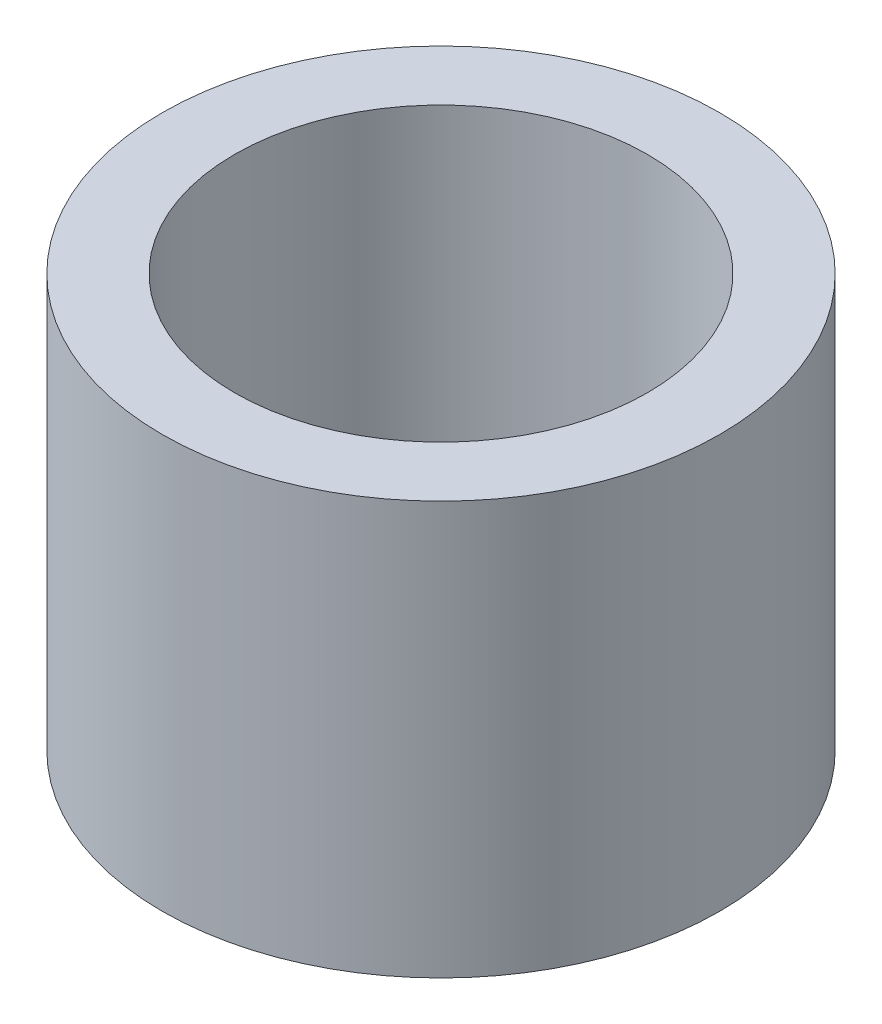
ISO-10303-21;
HEADER;
FILE_DESCRIPTION(('STEP AP214'),'2;1');
FILE_NAME('part.step','',(''),(''),'','','');
FILE_SCHEMA(('AUTOMOTIVE_DESIGN { 1 0 10303 214 1 1 1 1 }'));
ENDSEC;
DATA;
#1=APPLICATION_CONTEXT('core data for automotive mechanical design processes');
#2=APPLICATION_PROTOCOL_DEFINITION('international standard','automotive_design',2000,#1);
#3=PRODUCT_CONTEXT('',#1,'mechanical');
#4=PRODUCT('Part','Part','',(#3));
#5=PRODUCT_RELATED_PRODUCT_CATEGORY('part','',(#4));
#6=PRODUCT_DEFINITION_FORMATION('','',#4);
#7=PRODUCT_DEFINITION_CONTEXT('part definition',#1,'design');
#8=PRODUCT_DEFINITION('design','',#6,#7);
#9=PRODUCT_DEFINITION_SHAPE('','',#8);
#10=(LENGTH_UNIT() NAMED_UNIT(*) SI_UNIT(.MILLI.,.METRE.));
#11=(NAMED_UNIT(*) PLANE_ANGLE_UNIT() SI_UNIT($,.RADIAN.));
#12=(NAMED_UNIT(*) SI_UNIT($,.STERADIAN.) SOLID_ANGLE_UNIT());
#13=UNCERTAINTY_MEASURE_WITH_UNIT(LENGTH_MEASURE(1.E-05),#10,'distance_accuracy_value','');
#14=(GEOMETRIC_REPRESENTATION_CONTEXT(3) GLOBAL_UNCERTAINTY_ASSIGNED_CONTEXT((#13)) GLOBAL_UNIT_ASSIGNED_CONTEXT((#10,
#11,#12)) REPRESENTATION_CONTEXT('',''));
#15=CARTESIAN_POINT('',(0.,0.,0.));
#16=DIRECTION('',(0.,0.,1.));
#17=DIRECTION('',(1.,0.,0.));
#18=AXIS2_PLACEMENT_3D('',#15,#16,#17);
#19=CARTESIAN_POINT('',(0.,12.7,0.));
#20=DIRECTION('',(0.,1.,0.));
#21=DIRECTION('',(0.,0.,1.));
#22=AXIS2_PLACEMENT_3D('',#19,#20,#21);
#23=PLANE('',#22);
#24=CARTESIAN_POINT('',(0.,12.7,0.));
#25=DIRECTION('',(0.,1.,0.));
#26=DIRECTION('',(0.,0.,1.));
#27=AXIS2_PLACEMENT_3D('',#24,#25,#26);
#28=CIRCLE('',#27,8.5725);
#29=CARTESIAN_POINT('',(0.,12.7,8.5725));
#30=VERTEX_POINT('',#29);
#31=EDGE_CURVE('E10',#30,#30,#28,.T.);
#32=ORIENTED_EDGE('',*,*,#31,.T.);
#33=EDGE_LOOP('',(#32));
#34=FACE_BOUND('',#33,.T.);
#35=CARTESIAN_POINT('',(0.,12.7,0.));
#36=DIRECTION('',(0.,1.,0.));
#37=DIRECTION('',(0.,0.,1.));
#38=AXIS2_PLACEMENT_3D('',#35,#36,#37);
#39=CIRCLE('',#38,6.35);
#40=CARTESIAN_POINT('',(0.,12.7,6.35));
#41=VERTEX_POINT('',#40);
#42=EDGE_CURVE('E48',#41,#41,#39,.T.);
#43=ORIENTED_EDGE('',*,*,#42,.F.);
#44=EDGE_LOOP('',(#43));
#45=FACE_BOUND('',#44,.T.);
#46=ADVANCED_FACE('F37',(#34,#45),#23,.T.);
#47=CARTESIAN_POINT('',(0.,0.,0.));
#48=DIRECTION('',(0.,1.,0.));
#49=DIRECTION('',(0.,0.,1.));
#50=AXIS2_PLACEMENT_3D('',#47,#48,#49);
#51=PLANE('',#50);
#52=CARTESIAN_POINT('',(0.,0.,0.));
#53=DIRECTION('',(0.,1.,0.));
#54=DIRECTION('',(0.,0.,1.));
#55=AXIS2_PLACEMENT_3D('',#52,#53,#54);
#56=CIRCLE('',#55,8.5725);
#57=CARTESIAN_POINT('',(0.,0.,8.5725));
#58=VERTEX_POINT('',#57);
#59=EDGE_CURVE('E41',#58,#58,#56,.T.);
#60=ORIENTED_EDGE('',*,*,#59,.F.);
#61=EDGE_LOOP('',(#60));
#62=FACE_BOUND('',#61,.T.);
#63=CARTESIAN_POINT('',(0.,0.,0.));
#64=DIRECTION('',(0.,1.,0.));
#65=DIRECTION('',(0.,0.,1.));
#66=AXIS2_PLACEMENT_3D('',#63,#64,#65);
#67=CIRCLE('',#66,6.35);
#68=CARTESIAN_POINT('',(0.,0.,6.35));
#69=VERTEX_POINT('',#68);
#70=EDGE_CURVE('E50',#69,#69,#67,.T.);
#71=ORIENTED_EDGE('',*,*,#70,.T.);
#72=EDGE_LOOP('',(#71));
#73=FACE_BOUND('',#72,.T.);
#74=ADVANCED_FACE('F60',(#62,#73),#51,.F.);
#75=CARTESIAN_POINT('',(0.,12.7,0.));
#76=DIRECTION('',(0.,-1.,0.));
#77=DIRECTION('',(0.,0.,-1.));
#78=AXIS2_PLACEMENT_3D('',#75,#76,#77);
#79=CYLINDRICAL_SURFACE('',#78,8.5725);
#80=ORIENTED_EDGE('',*,*,#31,.F.);
#81=EDGE_LOOP('',(#80));
#82=FACE_BOUND('',#81,.T.);
#83=ORIENTED_EDGE('',*,*,#59,.T.);
#84=EDGE_LOOP('',(#83));
#85=FACE_BOUND('',#84,.T.);
#86=ADVANCED_FACE('F39',(#82,#85),#79,.T.);
#87=CARTESIAN_POINT('',(0.,12.7,0.));
#88=DIRECTION('',(0.,-1.,0.));
#89=DIRECTION('',(0.,0.,-1.));
#90=AXIS2_PLACEMENT_3D('',#87,#88,#89);
#91=CYLINDRICAL_SURFACE('',#90,6.35);
#92=ORIENTED_EDGE('',*,*,#42,.T.);
#93=EDGE_LOOP('',(#92));
#94=FACE_BOUND('',#93,.T.);
#95=ORIENTED_EDGE('',*,*,#70,.F.);
#96=EDGE_LOOP('',(#95));
#97=FACE_BOUND('',#96,.T.);
#98=ADVANCED_FACE('F56',(#94,#97),#91,.F.);
#99=CLOSED_SHELL('',(#46,#74,#86,#98));
#100=MANIFOLD_SOLID_BREP('B2',#99);
#101=ADVANCED_BREP_SHAPE_REPRESENTATION('',(#18,#100),#14);
#102=SHAPE_DEFINITION_REPRESENTATION(#9,#101);
ENDSEC;
END-ISO-10303-21;
